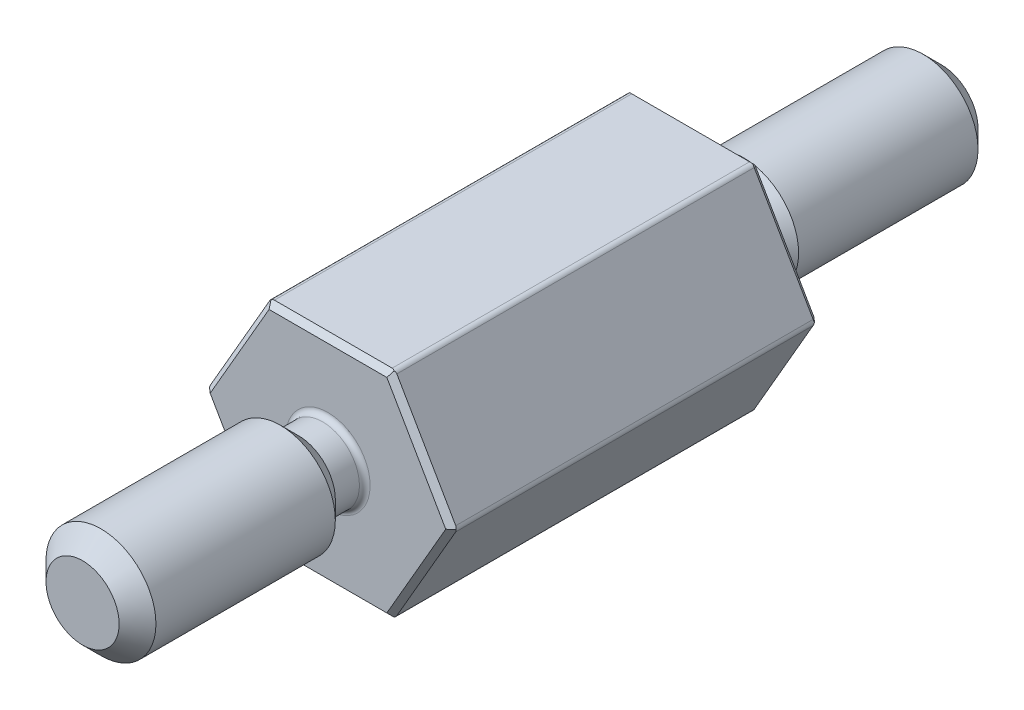
ISO-10303-21;
HEADER;
FILE_DESCRIPTION(('STEP AP214'),'2;1');
FILE_NAME('part.step','',(''),(''),'','','');
FILE_SCHEMA(('AUTOMOTIVE_DESIGN { 1 0 10303 214 1 1 1 1 }'));
ENDSEC;
DATA;
#1=APPLICATION_CONTEXT('core data for automotive mechanical design processes');
#2=APPLICATION_PROTOCOL_DEFINITION('international standard','automotive_design',2000,#1);
#3=PRODUCT_CONTEXT('',#1,'mechanical');
#4=PRODUCT('Part','Part','',(#3));
#5=PRODUCT_RELATED_PRODUCT_CATEGORY('part','',(#4));
#6=PRODUCT_DEFINITION_FORMATION('','',#4);
#7=PRODUCT_DEFINITION_CONTEXT('part definition',#1,'design');
#8=PRODUCT_DEFINITION('design','',#6,#7);
#9=PRODUCT_DEFINITION_SHAPE('','',#8);
#10=(LENGTH_UNIT() NAMED_UNIT(*) SI_UNIT(.MILLI.,.METRE.));
#11=(NAMED_UNIT(*) PLANE_ANGLE_UNIT() SI_UNIT($,.RADIAN.));
#12=(NAMED_UNIT(*) SI_UNIT($,.STERADIAN.) SOLID_ANGLE_UNIT());
#13=UNCERTAINTY_MEASURE_WITH_UNIT(LENGTH_MEASURE(1.E-05),#10,'distance_accuracy_value','');
#14=(GEOMETRIC_REPRESENTATION_CONTEXT(3) GLOBAL_UNCERTAINTY_ASSIGNED_CONTEXT((#13)) GLOBAL_UNIT_ASSIGNED_CONTEXT((#10,
#11,#12)) REPRESENTATION_CONTEXT('',''));
#15=CARTESIAN_POINT('',(0.,0.,0.));
#16=DIRECTION('',(0.,0.,1.));
#17=DIRECTION('',(1.,0.,0.));
#18=AXIS2_PLACEMENT_3D('',#15,#16,#17);
#19=CARTESIAN_POINT('',(0.,0.946150000000001,-11.1125));
#20=DIRECTION('',(0.,0.,1.));
#21=DIRECTION('',(1.,0.,0.));
#22=AXIS2_PLACEMENT_3D('',#19,#20,#21);
#23=PLANE('',#22);
#24=CARTESIAN_POINT('',(0.,0.,-11.1125));
#25=DIRECTION('',(0.,0.,1.));
#26=DIRECTION('',(1.,0.,0.));
#27=AXIS2_PLACEMENT_3D('',#24,#25,#26);
#28=CIRCLE('',#27,0.946150000000001);
#29=CARTESIAN_POINT('',(0.946150000000001,0.,-11.1125));
#30=VERTEX_POINT('',#29);
#31=EDGE_CURVE('E289',#30,#30,#28,.T.);
#32=ORIENTED_EDGE('',*,*,#31,.F.);
#33=EDGE_LOOP('',(#32));
#34=FACE_BOUND('',#33,.T.);
#35=ADVANCED_FACE('F37',(#34),#23,.F.);
#36=CARTESIAN_POINT('',(0.,2.778125,-4.7625));
#37=DIRECTION('',(0.,0.,1.));
#38=DIRECTION('',(1.,0.,0.));
#39=AXIS2_PLACEMENT_3D('',#36,#37,#38);
#40=PLANE('',#39);
#41=CARTESIAN_POINT('',(0.,0.,-4.7625));
#42=DIRECTION('',(0.,0.,1.));
#43=DIRECTION('',(1.,0.,0.));
#44=AXIS2_PLACEMENT_3D('',#41,#42,#43);
#45=CIRCLE('',#44,1.09140625);
#46=CARTESIAN_POINT('',(1.09140625,0.,-4.7625));
#47=VERTEX_POINT('',#46);
#48=EDGE_CURVE('E278',#47,#47,#45,.T.);
#49=ORIENTED_EDGE('',*,*,#48,.T.);
#50=EDGE_LOOP('',(#49));
#51=FACE_BOUND('',#50,.T.);
#52=DIRECTION('',(-0.5,0.866025403784439,0.));
#53=VECTOR('',#52,1.);
#54=CARTESIAN_POINT('',(-3.08760609194042,0.0694531250000091,-4.7625));
#55=LINE('',#54,#53);
#56=CARTESIAN_POINT('',(-1.5237536557628,-2.63921874999999,-4.7625));
#57=VERTEX_POINT('',#56);
#58=CARTESIAN_POINT('',(-3.0475073115256,0.,-4.7625));
#59=VERTEX_POINT('',#58);
#60=EDGE_CURVE('E228',#57,#59,#55,.T.);
#61=ORIENTED_EDGE('',*,*,#60,.T.);
#62=DIRECTION('',(0.5,0.866025403784439,0.));
#63=VECTOR('',#62,1.);
#64=CARTESIAN_POINT('',(-1.48365487534799,2.708671875,-4.7625));
#65=LINE('',#64,#63);
#66=CARTESIAN_POINT('',(-1.5237536557628,2.63921874999999,-4.7625));
#67=VERTEX_POINT('',#66);
#68=EDGE_CURVE('E205',#59,#67,#65,.T.);
#69=ORIENTED_EDGE('',*,*,#68,.T.);
#70=DIRECTION('',(1.,0.,0.));
#71=VECTOR('',#70,1.);
#72=CARTESIAN_POINT('',(1.60395121659242,2.63921874999999,-4.7625));
#73=LINE('',#72,#71);
#74=CARTESIAN_POINT('',(1.5237536557628,2.63921874999999,-4.7625));
#75=VERTEX_POINT('',#74);
#76=EDGE_CURVE('E216',#67,#75,#73,.T.);
#77=ORIENTED_EDGE('',*,*,#76,.T.);
#78=DIRECTION('',(0.5,-0.866025403784439,0.));
#79=VECTOR('',#78,1.);
#80=CARTESIAN_POINT('',(3.08760609194041,-0.0694531250000036,-4.7625));
#81=LINE('',#80,#79);
#82=CARTESIAN_POINT('',(3.0475073115256,0.,-4.7625));
#83=VERTEX_POINT('',#82);
#84=EDGE_CURVE('E223',#75,#83,#81,.T.);
#85=ORIENTED_EDGE('',*,*,#84,.T.);
#86=DIRECTION('',(-0.5,-0.866025403784439,0.));
#87=VECTOR('',#86,1.);
#88=CARTESIAN_POINT('',(1.48365487534799,-2.70867187499999,-4.7625));
#89=LINE('',#88,#87);
#90=CARTESIAN_POINT('',(1.5237536557628,-2.63921874999999,-4.7625));
#91=VERTEX_POINT('',#90);
#92=EDGE_CURVE('E413',#83,#91,#89,.T.);
#93=ORIENTED_EDGE('',*,*,#92,.T.);
#94=DIRECTION('',(-1.,0.,0.));
#95=VECTOR('',#94,1.);
#96=CARTESIAN_POINT('',(-1.60395121659243,-2.63921874999999,-4.7625));
#97=LINE('',#96,#95);
#98=EDGE_CURVE('E234',#91,#57,#97,.T.);
#99=ORIENTED_EDGE('',*,*,#98,.T.);
#100=EDGE_LOOP('',(#61,#69,#77,#85,#93,#99));
#101=FACE_BOUND('',#100,.T.);
#102=ADVANCED_FACE('F226',(#51,#101),#40,.F.);
#103=CARTESIAN_POINT('',(0.,0.,11.1125));
#104=DIRECTION('',(0.,0.,1.));
#105=DIRECTION('',(1.,0.,0.));
#106=AXIS2_PLACEMENT_3D('',#103,#104,#105);
#107=CYLINDRICAL_SURFACE('',#106,0.9525);
#108=CARTESIAN_POINT('',(0.,0.,-4.90140625));
#109=DIRECTION('',(0.,0.,1.));
#110=DIRECTION('',(1.,0.,0.));
#111=AXIS2_PLACEMENT_3D('',#108,#109,#110);
#112=CIRCLE('',#111,0.9525);
#113=CARTESIAN_POINT('',(0.9525,0.,-4.90140625));
#114=VERTEX_POINT('',#113);
#115=EDGE_CURVE('E306',#114,#114,#112,.F.);
#116=ORIENTED_EDGE('',*,*,#115,.T.);
#117=EDGE_LOOP('',(#116));
#118=FACE_BOUND('',#117,.T.);
#119=CARTESIAN_POINT('',(0.,0.,-5.5245));
#120=DIRECTION('',(0.,0.,1.));
#121=DIRECTION('',(1.,0.,0.));
#122=AXIS2_PLACEMENT_3D('',#119,#120,#121);
#123=CIRCLE('',#122,0.9525);
#124=CARTESIAN_POINT('',(0.9525,0.,-5.5245));
#125=VERTEX_POINT('',#124);
#126=EDGE_CURVE('E490',#125,#125,#123,.T.);
#127=ORIENTED_EDGE('',*,*,#126,.T.);
#128=EDGE_LOOP('',(#127));
#129=FACE_BOUND('',#128,.T.);
#130=ADVANCED_FACE('F510',(#118,#129),#107,.T.);
#131=CARTESIAN_POINT('',(0.,0.,-5.9944));
#132=DIRECTION('',(0.,0.,-1.));
#133=DIRECTION('',(-1.,0.,0.));
#134=AXIS2_PLACEMENT_3D('',#131,#132,#133);
#135=CONICAL_SURFACE('',#134,1.4224,0.785398163397449);
#136=ORIENTED_EDGE('',*,*,#126,.F.);
#137=EDGE_LOOP('',(#136));
#138=FACE_BOUND('',#137,.T.);
#139=CARTESIAN_POINT('',(0.,0.,-5.9944));
#140=DIRECTION('',(0.,0.,1.));
#141=DIRECTION('',(1.,0.,0.));
#142=AXIS2_PLACEMENT_3D('',#139,#140,#141);
#143=CIRCLE('',#142,1.4224);
#144=CARTESIAN_POINT('',(1.4224,0.,-5.9944));
#145=VERTEX_POINT('',#144);
#146=EDGE_CURVE('E493',#145,#145,#143,.T.);
#147=ORIENTED_EDGE('',*,*,#146,.T.);
#148=EDGE_LOOP('',(#147));
#149=FACE_BOUND('',#148,.T.);
#150=ADVANCED_FACE('F619',(#138,#149),#135,.T.);
#151=CARTESIAN_POINT('',(0.,0.,11.1125));
#152=DIRECTION('',(0.,0.,1.));
#153=DIRECTION('',(1.,0.,0.));
#154=AXIS2_PLACEMENT_3D('',#151,#152,#153);
#155=CYLINDRICAL_SURFACE('',#154,1.4224);
#156=ORIENTED_EDGE('',*,*,#146,.F.);
#157=EDGE_LOOP('',(#156));
#158=FACE_BOUND('',#157,.T.);
#159=CARTESIAN_POINT('',(0.,0.,-10.63625));
#160=DIRECTION('',(0.,0.,1.));
#161=DIRECTION('',(1.,0.,0.));
#162=AXIS2_PLACEMENT_3D('',#159,#160,#161);
#163=CIRCLE('',#162,1.4224);
#164=CARTESIAN_POINT('',(1.4224,0.,-10.63625));
#165=VERTEX_POINT('',#164);
#166=EDGE_CURVE('E496',#165,#165,#163,.T.);
#167=ORIENTED_EDGE('',*,*,#166,.T.);
#168=EDGE_LOOP('',(#167));
#169=FACE_BOUND('',#168,.T.);
#170=ADVANCED_FACE('F615',(#158,#169),#155,.T.);
#171=CARTESIAN_POINT('',(0.,0.,-11.1125));
#172=DIRECTION('',(0.,0.,1.));
#173=DIRECTION('',(1.,0.,0.));
#174=AXIS2_PLACEMENT_3D('',#171,#172,#173);
#175=CONICAL_SURFACE('',#174,0.946150000000001,0.785398163397447);
#176=ORIENTED_EDGE('',*,*,#166,.F.);
#177=EDGE_LOOP('',(#176));
#178=FACE_BOUND('',#177,.T.);
#179=ORIENTED_EDGE('',*,*,#31,.T.);
#180=EDGE_LOOP('',(#179));
#181=FACE_BOUND('',#180,.T.);
#182=ADVANCED_FACE('F502',(#178,#181),#175,.T.);
#183=CARTESIAN_POINT('',(-1.60395121659243,2.778125,-4.7625));
#184=DIRECTION('',(-0.866025403784439,0.5,0.));
#185=DIRECTION('',(-0.5,-0.866025403784439,0.));
#186=AXIS2_PLACEMENT_3D('',#183,#184,#185);
#187=PLANE('',#186);
#188=DIRECTION('',(-0.5,-0.866025403784439,0.));
#189=VECTOR('',#188,1.);
#190=CARTESIAN_POINT('',(-3.20790243318485,0.,-4.62359374999999));
#191=LINE('',#190,#189);
#192=CARTESIAN_POINT('',(-1.64404999700724,2.708671875,-4.62359374999999));
#193=VERTEX_POINT('',#192);
#194=CARTESIAN_POINT('',(-3.16780365277004,0.0694531250000045,-4.62359374999999));
#195=VERTEX_POINT('',#194);
#196=EDGE_CURVE('E224',#193,#195,#191,.T.);
#197=ORIENTED_EDGE('',*,*,#196,.T.);
#198=DIRECTION('',(0.,0.,1.));
#199=VECTOR('',#198,1.);
#200=CARTESIAN_POINT('',(-3.16780365277004,0.0694531250000048,-4.7625));
#201=LINE('',#200,#199);
#202=CARTESIAN_POINT('',(-3.16780365277004,0.0694531250000048,4.62359375));
#203=VERTEX_POINT('',#202);
#204=EDGE_CURVE('E317',#195,#203,#201,.T.);
#205=ORIENTED_EDGE('',*,*,#204,.T.);
#206=DIRECTION('',(0.5,0.866025403784439,0.));
#207=VECTOR('',#206,1.);
#208=CARTESIAN_POINT('',(-1.60395121659243,2.778125,4.62359375));
#209=LINE('',#208,#207);
#210=CARTESIAN_POINT('',(-1.64404999700724,2.708671875,4.62359375));
#211=VERTEX_POINT('',#210);
#212=EDGE_CURVE('E469',#203,#211,#209,.T.);
#213=ORIENTED_EDGE('',*,*,#212,.T.);
#214=DIRECTION('',(0.,0.,1.));
#215=VECTOR('',#214,1.);
#216=CARTESIAN_POINT('',(-1.64404999700724,2.708671875,-4.7625));
#217=LINE('',#216,#215);
#218=EDGE_CURVE('E315',#211,#193,#217,.F.);
#219=ORIENTED_EDGE('',*,*,#218,.T.);
#220=EDGE_LOOP('',(#197,#205,#213,#219));
#221=FACE_BOUND('',#220,.T.);
#222=ADVANCED_FACE('F468',(#221),#187,.T.);
#223=CARTESIAN_POINT('',(1.60395121659242,2.778125,-4.7625));
#224=DIRECTION('',(0.,1.,0.));
#225=DIRECTION('',(-1.,0.,0.));
#226=AXIS2_PLACEMENT_3D('',#223,#224,#225);
#227=PLANE('',#226);
#228=DIRECTION('',(-1.,0.,0.));
#229=VECTOR('',#228,1.);
#230=CARTESIAN_POINT('',(-1.60395121659243,2.778125,-4.62359374999999));
#231=LINE('',#230,#229);
#232=CARTESIAN_POINT('',(1.5237536557628,2.778125,-4.62359374999999));
#233=VERTEX_POINT('',#232);
#234=CARTESIAN_POINT('',(-1.52375365576281,2.778125,-4.62359374999999));
#235=VERTEX_POINT('',#234);
#236=EDGE_CURVE('E260',#233,#235,#231,.T.);
#237=ORIENTED_EDGE('',*,*,#236,.T.);
#238=DIRECTION('',(0.,0.,1.));
#239=VECTOR('',#238,1.);
#240=CARTESIAN_POINT('',(-1.52375365576281,2.778125,-4.7625));
#241=LINE('',#240,#239);
#242=CARTESIAN_POINT('',(-1.52375365576281,2.778125,4.62359375));
#243=VERTEX_POINT('',#242);
#244=EDGE_CURVE('E381',#235,#243,#241,.T.);
#245=ORIENTED_EDGE('',*,*,#244,.T.);
#246=DIRECTION('',(1.,0.,0.));
#247=VECTOR('',#246,1.);
#248=CARTESIAN_POINT('',(1.60395121659242,2.778125,4.62359375));
#249=LINE('',#248,#247);
#250=CARTESIAN_POINT('',(1.5237536557628,2.778125,4.62359375));
#251=VERTEX_POINT('',#250);
#252=EDGE_CURVE('E258',#243,#251,#249,.T.);
#253=ORIENTED_EDGE('',*,*,#252,.T.);
#254=DIRECTION('',(0.,0.,1.));
#255=VECTOR('',#254,1.);
#256=CARTESIAN_POINT('',(1.5237536557628,2.778125,-4.7625));
#257=LINE('',#256,#255);
#258=EDGE_CURVE('E379',#251,#233,#257,.F.);
#259=ORIENTED_EDGE('',*,*,#258,.T.);
#260=EDGE_LOOP('',(#237,#245,#253,#259));
#261=FACE_BOUND('',#260,.T.);
#262=ADVANCED_FACE('F564',(#261),#227,.T.);
#263=CARTESIAN_POINT('',(3.20790243318485,0.,-4.7625));
#264=DIRECTION('',(0.866025403784439,0.5,0.));
#265=DIRECTION('',(-0.5,0.866025403784439,0.));
#266=AXIS2_PLACEMENT_3D('',#263,#264,#265);
#267=PLANE('',#266);
#268=DIRECTION('',(0.5,-0.866025403784439,0.));
#269=VECTOR('',#268,1.);
#270=CARTESIAN_POINT('',(3.20790243318485,0.,4.62359375));
#271=LINE('',#270,#269);
#272=CARTESIAN_POINT('',(1.64404999700724,2.708671875,4.62359375));
#273=VERTEX_POINT('',#272);
#274=CARTESIAN_POINT('',(3.16780365277004,0.0694531250000003,4.62359375));
#275=VERTEX_POINT('',#274);
#276=EDGE_CURVE('E252',#273,#275,#271,.T.);
#277=ORIENTED_EDGE('',*,*,#276,.T.);
#278=DIRECTION('',(0.,0.,1.));
#279=VECTOR('',#278,1.);
#280=CARTESIAN_POINT('',(3.16780365277004,0.0694531250000004,-4.7625));
#281=LINE('',#280,#279);
#282=CARTESIAN_POINT('',(3.16780365277004,0.0694531250000005,-4.62359374999999));
#283=VERTEX_POINT('',#282);
#284=EDGE_CURVE('E373',#275,#283,#281,.F.);
#285=ORIENTED_EDGE('',*,*,#284,.T.);
#286=DIRECTION('',(-0.5,0.866025403784439,0.));
#287=VECTOR('',#286,1.);
#288=CARTESIAN_POINT('',(1.60395121659242,2.778125,-4.62359374999999));
#289=LINE('',#288,#287);
#290=CARTESIAN_POINT('',(1.64404999700724,2.708671875,-4.62359374999999));
#291=VERTEX_POINT('',#290);
#292=EDGE_CURVE('E255',#283,#291,#289,.T.);
#293=ORIENTED_EDGE('',*,*,#292,.T.);
#294=DIRECTION('',(0.,0.,1.));
#295=VECTOR('',#294,1.);
#296=CARTESIAN_POINT('',(1.64404999700724,2.708671875,-4.7625));
#297=LINE('',#296,#295);
#298=EDGE_CURVE('E370',#291,#273,#297,.T.);
#299=ORIENTED_EDGE('',*,*,#298,.T.);
#300=EDGE_LOOP('',(#277,#285,#293,#299));
#301=FACE_BOUND('',#300,.T.);
#302=ADVANCED_FACE('F395',(#301),#267,.T.);
#303=CARTESIAN_POINT('',(1.60395121659243,-2.77812499999999,-4.7625));
#304=DIRECTION('',(0.866025403784439,-0.5,0.));
#305=DIRECTION('',(0.5,0.866025403784439,0.));
#306=AXIS2_PLACEMENT_3D('',#303,#304,#305);
#307=PLANE('',#306);
#308=DIRECTION('',(-0.5,-0.866025403784439,0.));
#309=VECTOR('',#308,1.);
#310=CARTESIAN_POINT('',(1.60395121659243,-2.77812499999999,4.62359375));
#311=LINE('',#310,#309);
#312=CARTESIAN_POINT('',(3.16780365277004,-0.0694531250000001,4.62359375));
#313=VERTEX_POINT('',#312);
#314=CARTESIAN_POINT('',(1.64404999700724,-2.70867187499999,4.62359375));
#315=VERTEX_POINT('',#314);
#316=EDGE_CURVE('E246',#313,#315,#311,.T.);
#317=ORIENTED_EDGE('',*,*,#316,.T.);
#318=DIRECTION('',(0.,0.,1.));
#319=VECTOR('',#318,1.);
#320=CARTESIAN_POINT('',(1.64404999700724,-2.70867187499999,-4.7625));
#321=LINE('',#320,#319);
#322=CARTESIAN_POINT('',(1.64404999700724,-2.70867187499999,-4.62359374999999));
#323=VERTEX_POINT('',#322);
#324=EDGE_CURVE('E360',#315,#323,#321,.F.);
#325=ORIENTED_EDGE('',*,*,#324,.T.);
#326=DIRECTION('',(0.5,0.866025403784439,0.));
#327=VECTOR('',#326,1.);
#328=CARTESIAN_POINT('',(3.20790243318485,0.,-4.62359374999999));
#329=LINE('',#328,#327);
#330=CARTESIAN_POINT('',(3.16780365277004,-0.0694531249999996,-4.62359374999999));
#331=VERTEX_POINT('',#330);
#332=EDGE_CURVE('E249',#323,#331,#329,.T.);
#333=ORIENTED_EDGE('',*,*,#332,.T.);
#334=DIRECTION('',(0.,0.,1.));
#335=VECTOR('',#334,1.);
#336=CARTESIAN_POINT('',(3.16780365277004,-0.0694531250000001,-4.7625));
#337=LINE('',#336,#335);
#338=EDGE_CURVE('E357',#331,#313,#337,.T.);
#339=ORIENTED_EDGE('',*,*,#338,.T.);
#340=EDGE_LOOP('',(#317,#325,#333,#339));
#341=FACE_BOUND('',#340,.T.);
#342=ADVANCED_FACE('F416',(#341),#307,.T.);
#343=CARTESIAN_POINT('',(-1.60395121659243,-2.778125,-4.7625));
#344=DIRECTION('',(0.,-1.,0.));
#345=DIRECTION('',(1.,0.,0.));
#346=AXIS2_PLACEMENT_3D('',#343,#344,#345);
#347=PLANE('',#346);
#348=DIRECTION('',(-1.,0.,0.));
#349=VECTOR('',#348,1.);
#350=CARTESIAN_POINT('',(-1.60395121659243,-2.778125,4.62359375));
#351=LINE('',#350,#349);
#352=CARTESIAN_POINT('',(1.52375365576281,-2.77812499999999,4.62359375));
#353=VERTEX_POINT('',#352);
#354=CARTESIAN_POINT('',(-1.52375365576281,-2.778125,4.62359375));
#355=VERTEX_POINT('',#354);
#356=EDGE_CURVE('E240',#353,#355,#351,.T.);
#357=ORIENTED_EDGE('',*,*,#356,.T.);
#358=DIRECTION('',(0.,0.,1.));
#359=VECTOR('',#358,1.);
#360=CARTESIAN_POINT('',(-1.52375365576281,-2.778125,-4.7625));
#361=LINE('',#360,#359);
#362=CARTESIAN_POINT('',(-1.52375365576281,-2.778125,-4.62359374999999));
#363=VERTEX_POINT('',#362);
#364=EDGE_CURVE('E347',#355,#363,#361,.F.);
#365=ORIENTED_EDGE('',*,*,#364,.T.);
#366=DIRECTION('',(1.,0.,0.));
#367=VECTOR('',#366,1.);
#368=CARTESIAN_POINT('',(1.60395121659243,-2.77812499999999,-4.62359374999999));
#369=LINE('',#368,#367);
#370=CARTESIAN_POINT('',(1.52375365576281,-2.77812499999999,-4.62359374999999));
#371=VERTEX_POINT('',#370);
#372=EDGE_CURVE('E243',#363,#371,#369,.T.);
#373=ORIENTED_EDGE('',*,*,#372,.T.);
#374=DIRECTION('',(0.,0.,1.));
#375=VECTOR('',#374,1.);
#376=CARTESIAN_POINT('',(1.52375365576281,-2.77812499999999,-4.7625));
#377=LINE('',#376,#375);
#378=EDGE_CURVE('E344',#371,#353,#377,.T.);
#379=ORIENTED_EDGE('',*,*,#378,.T.);
#380=EDGE_LOOP('',(#357,#365,#373,#379));
#381=FACE_BOUND('',#380,.T.);
#382=ADVANCED_FACE('F435',(#381),#347,.T.);
#383=CARTESIAN_POINT('',(-3.20790243318485,0.,-4.7625));
#384=DIRECTION('',(-0.866025403784439,-0.5,0.));
#385=DIRECTION('',(0.5,-0.866025403784439,0.));
#386=AXIS2_PLACEMENT_3D('',#383,#384,#385);
#387=PLANE('',#386);
#388=DIRECTION('',(-0.5,0.866025403784439,0.));
#389=VECTOR('',#388,1.);
#390=CARTESIAN_POINT('',(-3.20790243318485,0.,4.62359375));
#391=LINE('',#390,#389);
#392=CARTESIAN_POINT('',(-1.64404999700724,-2.708671875,4.62359375));
#393=VERTEX_POINT('',#392);
#394=CARTESIAN_POINT('',(-3.16780365277004,-0.0694531249999952,4.62359375));
#395=VERTEX_POINT('',#394);
#396=EDGE_CURVE('E229',#393,#395,#391,.T.);
#397=ORIENTED_EDGE('',*,*,#396,.T.);
#398=DIRECTION('',(0.,0.,1.));
#399=VECTOR('',#398,1.);
#400=CARTESIAN_POINT('',(-3.16780365277004,-0.0694531249999951,-4.7625));
#401=LINE('',#400,#399);
#402=CARTESIAN_POINT('',(-3.16780365277004,-0.0694531249999949,-4.62359374999999));
#403=VERTEX_POINT('',#402);
#404=EDGE_CURVE('E331',#395,#403,#401,.F.);
#405=ORIENTED_EDGE('',*,*,#404,.T.);
#406=DIRECTION('',(0.5,-0.866025403784439,0.));
#407=VECTOR('',#406,1.);
#408=CARTESIAN_POINT('',(-1.60395121659243,-2.778125,-4.62359374999999));
#409=LINE('',#408,#407);
#410=CARTESIAN_POINT('',(-1.64404999700724,-2.70867187499999,-4.62359374999999));
#411=VERTEX_POINT('',#410);
#412=EDGE_CURVE('E232',#403,#411,#409,.T.);
#413=ORIENTED_EDGE('',*,*,#412,.T.);
#414=DIRECTION('',(0.,0.,1.));
#415=VECTOR('',#414,1.);
#416=CARTESIAN_POINT('',(-1.64404999700724,-2.70867187499999,-4.7625));
#417=LINE('',#416,#415);
#418=EDGE_CURVE('E328',#411,#393,#417,.T.);
#419=ORIENTED_EDGE('',*,*,#418,.T.);
#420=EDGE_LOOP('',(#397,#405,#413,#419));
#421=FACE_BOUND('',#420,.T.);
#422=ADVANCED_FACE('F452',(#421),#387,.T.);
#423=CARTESIAN_POINT('',(0.,0.,11.1125));
#424=DIRECTION('',(0.,0.,-1.));
#425=DIRECTION('',(-1.,0.,0.));
#426=AXIS2_PLACEMENT_3D('',#423,#424,#425);
#427=PLANE('',#426);
#428=CARTESIAN_POINT('',(0.,0.,11.1125));
#429=DIRECTION('',(0.,0.,1.));
#430=DIRECTION('',(1.,0.,0.));
#431=AXIS2_PLACEMENT_3D('',#428,#429,#430);
#432=CIRCLE('',#431,0.946149999999999);
#433=CARTESIAN_POINT('',(0.946149999999999,0.,11.1125));
#434=VERTEX_POINT('',#433);
#435=EDGE_CURVE('E473',#434,#434,#432,.T.);
#436=ORIENTED_EDGE('',*,*,#435,.T.);
#437=EDGE_LOOP('',(#436));
#438=FACE_BOUND('',#437,.T.);
#439=ADVANCED_FACE('F515',(#438),#427,.F.);
#440=CARTESIAN_POINT('',(0.,0.,10.63625));
#441=DIRECTION('',(0.,0.,-1.));
#442=DIRECTION('',(-1.,0.,0.));
#443=AXIS2_PLACEMENT_3D('',#440,#441,#442);
#444=CONICAL_SURFACE('',#443,1.4224,0.78539816339745);
#445=ORIENTED_EDGE('',*,*,#435,.F.);
#446=EDGE_LOOP('',(#445));
#447=FACE_BOUND('',#446,.T.);
#448=CARTESIAN_POINT('',(0.,0.,10.63625));
#449=DIRECTION('',(0.,0.,1.));
#450=DIRECTION('',(1.,0.,0.));
#451=AXIS2_PLACEMENT_3D('',#448,#449,#450);
#452=CIRCLE('',#451,1.4224);
#453=CARTESIAN_POINT('',(1.4224,0.,10.63625));
#454=VERTEX_POINT('',#453);
#455=EDGE_CURVE('E477',#454,#454,#452,.T.);
#456=ORIENTED_EDGE('',*,*,#455,.T.);
#457=EDGE_LOOP('',(#456));
#458=FACE_BOUND('',#457,.T.);
#459=ADVANCED_FACE('F586',(#447,#458),#444,.T.);
#460=CARTESIAN_POINT('',(0.,0.,11.1125));
#461=DIRECTION('',(0.,0.,1.));
#462=DIRECTION('',(1.,0.,0.));
#463=AXIS2_PLACEMENT_3D('',#460,#461,#462);
#464=CYLINDRICAL_SURFACE('',#463,1.4224);
#465=ORIENTED_EDGE('',*,*,#455,.F.);
#466=EDGE_LOOP('',(#465));
#467=FACE_BOUND('',#466,.T.);
#468=CARTESIAN_POINT('',(0.,0.,5.9944));
#469=DIRECTION('',(0.,0.,1.));
#470=DIRECTION('',(1.,0.,0.));
#471=AXIS2_PLACEMENT_3D('',#468,#469,#470);
#472=CIRCLE('',#471,1.4224);
#473=CARTESIAN_POINT('',(1.4224,0.,5.9944));
#474=VERTEX_POINT('',#473);
#475=EDGE_CURVE('E484',#474,#474,#472,.T.);
#476=ORIENTED_EDGE('',*,*,#475,.T.);
#477=EDGE_LOOP('',(#476));
#478=FACE_BOUND('',#477,.T.);
#479=ADVANCED_FACE('F583',(#467,#478),#464,.T.);
#480=CARTESIAN_POINT('',(0.,0.,5.5245));
#481=DIRECTION('',(0.,0.,1.));
#482=DIRECTION('',(1.,0.,0.));
#483=AXIS2_PLACEMENT_3D('',#480,#481,#482);
#484=CONICAL_SURFACE('',#483,0.9525,0.785398163397452);
#485=ORIENTED_EDGE('',*,*,#475,.F.);
#486=EDGE_LOOP('',(#485));
#487=FACE_BOUND('',#486,.T.);
#488=CARTESIAN_POINT('',(0.,0.,5.5245));
#489=DIRECTION('',(0.,0.,1.));
#490=DIRECTION('',(1.,0.,0.));
#491=AXIS2_PLACEMENT_3D('',#488,#489,#490);
#492=CIRCLE('',#491,0.9525);
#493=CARTESIAN_POINT('',(0.9525,0.,5.5245));
#494=VERTEX_POINT('',#493);
#495=EDGE_CURVE('E487',#494,#494,#492,.T.);
#496=ORIENTED_EDGE('',*,*,#495,.T.);
#497=EDGE_LOOP('',(#496));
#498=FACE_BOUND('',#497,.T.);
#499=ADVANCED_FACE('F576',(#487,#498),#484,.T.);
#500=CARTESIAN_POINT('',(0.,0.,11.1125));
#501=DIRECTION('',(0.,0.,1.));
#502=DIRECTION('',(1.,0.,0.));
#503=AXIS2_PLACEMENT_3D('',#500,#501,#502);
#504=CYLINDRICAL_SURFACE('',#503,0.9525);
#505=CARTESIAN_POINT('',(0.,0.,4.90140625));
#506=DIRECTION('',(0.,0.,-1.));
#507=DIRECTION('',(-1.,0.,0.));
#508=AXIS2_PLACEMENT_3D('',#505,#506,#507);
#509=CIRCLE('',#508,0.9525);
#510=CARTESIAN_POINT('',(-0.9525,0.,4.90140625));
#511=VERTEX_POINT('',#510);
#512=EDGE_CURVE('E309',#511,#511,#509,.F.);
#513=ORIENTED_EDGE('',*,*,#512,.T.);
#514=EDGE_LOOP('',(#513));
#515=FACE_BOUND('',#514,.T.);
#516=ORIENTED_EDGE('',*,*,#495,.F.);
#517=EDGE_LOOP('',(#516));
#518=FACE_BOUND('',#517,.T.);
#519=ADVANCED_FACE('F570',(#515,#518),#504,.T.);
#520=CARTESIAN_POINT('',(0.,0.9525,4.7625));
#521=DIRECTION('',(0.,0.,-1.));
#522=DIRECTION('',(-1.,0.,0.));
#523=AXIS2_PLACEMENT_3D('',#520,#521,#522);
#524=PLANE('',#523);
#525=CARTESIAN_POINT('',(0.,0.,4.7625));
#526=DIRECTION('',(0.,0.,-1.));
#527=DIRECTION('',(-1.,0.,0.));
#528=AXIS2_PLACEMENT_3D('',#525,#526,#527);
#529=CIRCLE('',#528,1.09140625);
#530=CARTESIAN_POINT('',(-1.09140625,0.,4.7625));
#531=VERTEX_POINT('',#530);
#532=EDGE_CURVE('E312',#531,#531,#529,.T.);
#533=ORIENTED_EDGE('',*,*,#532,.T.);
#534=EDGE_LOOP('',(#533));
#535=FACE_BOUND('',#534,.T.);
#536=DIRECTION('',(0.5,-0.866025403784439,0.));
#537=VECTOR('',#536,1.);
#538=CARTESIAN_POINT('',(-1.48365487534799,-2.70867187499999,4.7625));
#539=LINE('',#538,#537);
#540=CARTESIAN_POINT('',(-3.04750731152561,0.,4.7625));
#541=VERTEX_POINT('',#540);
#542=CARTESIAN_POINT('',(-1.5237536557628,-2.63921874999999,4.7625));
#543=VERTEX_POINT('',#542);
#544=EDGE_CURVE('E273',#541,#543,#539,.T.);
#545=ORIENTED_EDGE('',*,*,#544,.T.);
#546=DIRECTION('',(1.,0.,0.));
#547=VECTOR('',#546,1.);
#548=CARTESIAN_POINT('',(1.60395121659243,-2.63921874999999,4.7625));
#549=LINE('',#548,#547);
#550=CARTESIAN_POINT('',(1.5237536557628,-2.63921874999999,4.7625));
#551=VERTEX_POINT('',#550);
#552=EDGE_CURVE('E275',#543,#551,#549,.T.);
#553=ORIENTED_EDGE('',*,*,#552,.T.);
#554=DIRECTION('',(0.5,0.866025403784439,0.));
#555=VECTOR('',#554,1.);
#556=CARTESIAN_POINT('',(3.08760609194042,0.069453125000002,4.7625));
#557=LINE('',#556,#555);
#558=CARTESIAN_POINT('',(3.04750731152561,0.,4.7625));
#559=VERTEX_POINT('',#558);
#560=EDGE_CURVE('E263',#551,#559,#557,.T.);
#561=ORIENTED_EDGE('',*,*,#560,.T.);
#562=DIRECTION('',(-0.5,0.866025403784439,0.));
#563=VECTOR('',#562,1.);
#564=CARTESIAN_POINT('',(1.48365487534799,2.708671875,4.7625));
#565=LINE('',#564,#563);
#566=CARTESIAN_POINT('',(1.5237536557628,2.63921875,4.7625));
#567=VERTEX_POINT('',#566);
#568=EDGE_CURVE('E266',#559,#567,#565,.T.);
#569=ORIENTED_EDGE('',*,*,#568,.T.);
#570=DIRECTION('',(-1.,0.,0.));
#571=VECTOR('',#570,1.);
#572=CARTESIAN_POINT('',(-1.60395121659243,2.63921875,4.7625));
#573=LINE('',#572,#571);
#574=CARTESIAN_POINT('',(-1.52375365576281,2.63921875,4.7625));
#575=VERTEX_POINT('',#574);
#576=EDGE_CURVE('E269',#567,#575,#573,.T.);
#577=ORIENTED_EDGE('',*,*,#576,.T.);
#578=DIRECTION('',(-0.5,-0.866025403784439,0.));
#579=VECTOR('',#578,1.);
#580=CARTESIAN_POINT('',(-3.08760609194042,-0.0694531249999958,4.7625));
#581=LINE('',#580,#579);
#582=EDGE_CURVE('E271',#575,#541,#581,.T.);
#583=ORIENTED_EDGE('',*,*,#582,.T.);
#584=EDGE_LOOP('',(#545,#553,#561,#569,#577,#583));
#585=FACE_BOUND('',#584,.T.);
#586=ADVANCED_FACE('F530',(#535,#585),#524,.F.);
#587=CARTESIAN_POINT('',(1.60395121659243,-2.77812499999999,-4.62359374999999));
#588=DIRECTION('',(0.612372435695794,-0.353553390593273,-0.707106781186548));
#589=DIRECTION('',(-0.5,-0.866025403784439,0.));
#590=AXIS2_PLACEMENT_3D('',#587,#588,#589);
#591=PLANE('',#590);
#592=ORIENTED_EDGE('',*,*,#332,.F.);
#593=CARTESIAN_POINT('',(1.52375365576281,-2.63921875,-4.76249999999999));
#594=DIRECTION('',(0.612372435695794,-0.353553390593273,-0.707106781186548));
#595=DIRECTION('',(0.612372435695795,-0.353553390593274,0.707106781186547));
#596=AXIS2_PLACEMENT_3D('',#593,#594,#595);
#597=ELLIPSE('',#596,0.196443102648388,0.13890625);
#598=CARTESIAN_POINT('',(1.59320678076281,-2.75951509124443,-4.64220365875556));
#599=VERTEX_POINT('',#598);
#600=EDGE_CURVE('E364',#323,#599,#597,.T.);
#601=ORIENTED_EDGE('',*,*,#600,.T.);
#602=DIRECTION('',(-0.377964473009229,0.654653670707976,-0.654653670707977));
#603=VECTOR('',#602,1.);
#604=CARTESIAN_POINT('',(1.60395121659243,-2.77812499999999,-4.62359374999999));
#605=LINE('',#604,#603);
#606=EDGE_CURVE('E284',#91,#599,#605,.F.);
#607=ORIENTED_EDGE('',*,*,#606,.F.);
#608=ORIENTED_EDGE('',*,*,#92,.F.);
#609=DIRECTION('',(-0.755928946018455,0.,-0.654653670707977));
#610=VECTOR('',#609,1.);
#611=CARTESIAN_POINT('',(3.20790243318485,0.,-4.62359374999999));
#612=LINE('',#611,#610);
#613=CARTESIAN_POINT('',(3.18641356152561,0.,-4.64220365875556));
#614=VERTEX_POINT('',#613);
#615=EDGE_CURVE('E287',#614,#83,#612,.T.);
#616=ORIENTED_EDGE('',*,*,#615,.F.);
#617=CARTESIAN_POINT('',(3.04750731152561,0.,-4.76249999999999));
#618=DIRECTION('',(0.612372435695794,-0.353553390593273,-0.707106781186548));
#619=DIRECTION('',(0.612372435695795,-0.353553390593274,0.707106781186547));
#620=AXIS2_PLACEMENT_3D('',#617,#618,#619);
#621=ELLIPSE('',#620,0.196443102648388,0.13890625);
#622=EDGE_CURVE('E362',#614,#331,#621,.T.);
#623=ORIENTED_EDGE('',*,*,#622,.T.);
#624=EDGE_LOOP('',(#592,#601,#607,#608,#616,#623));
#625=FACE_BOUND('',#624,.T.);
#626=ADVANCED_FACE('F411',(#625),#591,.T.);
#627=CARTESIAN_POINT('',(3.20790243318485,0.,-4.62359374999999));
#628=DIRECTION('',(0.612372435695794,0.353553390593274,-0.707106781186547));
#629=DIRECTION('',(0.5,-0.866025403784439,0.));
#630=AXIS2_PLACEMENT_3D('',#627,#628,#629);
#631=PLANE('',#630);
#632=ORIENTED_EDGE('',*,*,#292,.F.);
#633=CARTESIAN_POINT('',(3.04750731152561,0.,-4.76249999999999));
#634=DIRECTION('',(0.612372435695794,0.353553390593274,-0.707106781186547));
#635=DIRECTION('',(0.612372435695795,0.353553390593274,0.707106781186548));
#636=AXIS2_PLACEMENT_3D('',#633,#634,#635);
#637=ELLIPSE('',#636,0.196443102648388,0.13890625);
#638=EDGE_CURVE('E377',#283,#614,#637,.T.);
#639=ORIENTED_EDGE('',*,*,#638,.T.);
#640=ORIENTED_EDGE('',*,*,#615,.T.);
#641=ORIENTED_EDGE('',*,*,#84,.F.);
#642=DIRECTION('',(-0.377964473009228,-0.654653670707976,-0.654653670707977));
#643=VECTOR('',#642,1.);
#644=CARTESIAN_POINT('',(1.60395121659242,2.778125,-4.62359374999999));
#645=LINE('',#644,#643);
#646=CARTESIAN_POINT('',(1.5932067807628,2.75951509124443,-4.64220365875556));
#647=VERTEX_POINT('',#646);
#648=EDGE_CURVE('E219',#647,#75,#645,.T.);
#649=ORIENTED_EDGE('',*,*,#648,.F.);
#650=CARTESIAN_POINT('',(1.5237536557628,2.63921875,-4.76249999999999));
#651=DIRECTION('',(0.612372435695794,0.353553390593274,-0.707106781186547));
#652=DIRECTION('',(0.612372435695795,0.353553390593274,0.707106781186548));
#653=AXIS2_PLACEMENT_3D('',#650,#651,#652);
#654=ELLIPSE('',#653,0.196443102648388,0.13890625);
#655=EDGE_CURVE('E375',#647,#291,#654,.T.);
#656=ORIENTED_EDGE('',*,*,#655,.T.);
#657=EDGE_LOOP('',(#632,#639,#640,#641,#649,#656));
#658=FACE_BOUND('',#657,.T.);
#659=ADVANCED_FACE('F391',(#658),#631,.T.);
#660=CARTESIAN_POINT('',(-1.60395121659243,-2.778125,-4.62359374999999));
#661=DIRECTION('',(0.,-0.707106781186548,-0.707106781186547));
#662=DIRECTION('',(-1.,0.,0.));
#663=AXIS2_PLACEMENT_3D('',#660,#661,#662);
#664=PLANE('',#663);
#665=ORIENTED_EDGE('',*,*,#372,.F.);
#666=CARTESIAN_POINT('',(-1.52375365576281,-2.63921875,-4.76249999999999));
#667=DIRECTION('',(0.,-0.707106781186548,-0.707106781186547));
#668=DIRECTION('',(0.,-0.707106781186547,0.707106781186548));
#669=AXIS2_PLACEMENT_3D('',#666,#667,#668);
#670=ELLIPSE('',#669,0.196443102648388,0.13890625);
#671=CARTESIAN_POINT('',(-1.59320678076281,-2.75951509124443,-4.64220365875556));
#672=VERTEX_POINT('',#671);
#673=EDGE_CURVE('E351',#363,#672,#670,.T.);
#674=ORIENTED_EDGE('',*,*,#673,.T.);
#675=DIRECTION('',(0.377964473009229,0.654653670707976,-0.654653670707977));
#676=VECTOR('',#675,1.);
#677=CARTESIAN_POINT('',(-1.60395121659243,-2.778125,-4.62359374999999));
#678=LINE('',#677,#676);
#679=EDGE_CURVE('E212',#57,#672,#678,.F.);
#680=ORIENTED_EDGE('',*,*,#679,.F.);
#681=ORIENTED_EDGE('',*,*,#98,.F.);
#682=ORIENTED_EDGE('',*,*,#606,.T.);
#683=CARTESIAN_POINT('',(1.52375365576281,-2.63921875,-4.76249999999999));
#684=DIRECTION('',(0.,-0.707106781186548,-0.707106781186547));
#685=DIRECTION('',(0.,-0.707106781186547,0.707106781186548));
#686=AXIS2_PLACEMENT_3D('',#683,#684,#685);
#687=ELLIPSE('',#686,0.196443102648388,0.13890625);
#688=EDGE_CURVE('E349',#599,#371,#687,.T.);
#689=ORIENTED_EDGE('',*,*,#688,.T.);
#690=EDGE_LOOP('',(#665,#674,#680,#681,#682,#689));
#691=FACE_BOUND('',#690,.T.);
#692=ADVANCED_FACE('F431',(#691),#664,.T.);
#693=CARTESIAN_POINT('',(1.60395121659242,2.778125,-4.62359374999999));
#694=DIRECTION('',(0.,0.707106781186548,-0.707106781186547));
#695=DIRECTION('',(1.,0.,0.));
#696=AXIS2_PLACEMENT_3D('',#693,#694,#695);
#697=PLANE('',#696);
#698=DIRECTION('',(-0.37796447300923,0.654653670707976,0.654653670707977));
#699=VECTOR('',#698,1.);
#700=CARTESIAN_POINT('',(-1.14567944042316,1.984375,-5.41734375));
#701=LINE('',#700,#699);
#702=CARTESIAN_POINT('',(-1.59320678076281,2.75951509124443,-4.64220365875556));
#703=VERTEX_POINT('',#702);
#704=EDGE_CURVE('E200',#703,#67,#701,.F.);
#705=ORIENTED_EDGE('',*,*,#704,.F.);
#706=CARTESIAN_POINT('',(-1.52375365576281,2.63921875,-4.76249999999999));
#707=DIRECTION('',(0.,0.707106781186548,-0.707106781186547));
#708=DIRECTION('',(0.,0.707106781186547,0.707106781186548));
#709=AXIS2_PLACEMENT_3D('',#706,#707,#708);
#710=ELLIPSE('',#709,0.196443102648388,0.13890625);
#711=EDGE_CURVE('E11',#703,#235,#710,.T.);
#712=ORIENTED_EDGE('',*,*,#711,.T.);
#713=ORIENTED_EDGE('',*,*,#236,.F.);
#714=CARTESIAN_POINT('',(1.5237536557628,2.63921875,-4.76249999999999));
#715=DIRECTION('',(0.,0.707106781186548,-0.707106781186547));
#716=DIRECTION('',(0.,0.707106781186547,0.707106781186548));
#717=AXIS2_PLACEMENT_3D('',#714,#715,#716);
#718=ELLIPSE('',#717,0.196443102648388,0.13890625);
#719=EDGE_CURVE('E45',#233,#647,#718,.T.);
#720=ORIENTED_EDGE('',*,*,#719,.T.);
#721=ORIENTED_EDGE('',*,*,#648,.T.);
#722=ORIENTED_EDGE('',*,*,#76,.F.);
#723=EDGE_LOOP('',(#705,#712,#713,#720,#721,#722));
#724=FACE_BOUND('',#723,.T.);
#725=ADVANCED_FACE('F217',(#724),#697,.T.);
#726=CARTESIAN_POINT('',(-3.20790243318485,0.,-4.62359374999999));
#727=DIRECTION('',(-0.612372435695794,-0.353553390593273,-0.707106781186548));
#728=DIRECTION('',(-0.5,0.866025403784439,0.));
#729=AXIS2_PLACEMENT_3D('',#726,#727,#728);
#730=PLANE('',#729);
#731=ORIENTED_EDGE('',*,*,#412,.F.);
#732=CARTESIAN_POINT('',(-3.04750731152561,0.,-4.76249999999999));
#733=DIRECTION('',(-0.612372435695794,-0.353553390593273,-0.707106781186548));
#734=DIRECTION('',(-0.612372435695795,-0.353553390593273,0.707106781186547));
#735=AXIS2_PLACEMENT_3D('',#732,#733,#734);
#736=ELLIPSE('',#735,0.196443102648388,0.13890625);
#737=CARTESIAN_POINT('',(-3.18641356152561,0.,-4.64220365875556));
#738=VERTEX_POINT('',#737);
#739=EDGE_CURVE('E335',#403,#738,#736,.T.);
#740=ORIENTED_EDGE('',*,*,#739,.T.);
#741=DIRECTION('',(0.755928946018455,0.,-0.654653670707977));
#742=VECTOR('',#741,1.);
#743=CARTESIAN_POINT('',(-3.20790243318485,0.,-4.62359374999999));
#744=LINE('',#743,#742);
#745=EDGE_CURVE('E213',#59,#738,#744,.F.);
#746=ORIENTED_EDGE('',*,*,#745,.F.);
#747=ORIENTED_EDGE('',*,*,#60,.F.);
#748=ORIENTED_EDGE('',*,*,#679,.T.);
#749=CARTESIAN_POINT('',(-1.52375365576281,-2.63921875,-4.76249999999999));
#750=DIRECTION('',(-0.612372435695794,-0.353553390593273,-0.707106781186548));
#751=DIRECTION('',(-0.612372435695795,-0.353553390593273,0.707106781186547));
#752=AXIS2_PLACEMENT_3D('',#749,#750,#751);
#753=ELLIPSE('',#752,0.196443102648388,0.13890625);
#754=EDGE_CURVE('E333',#672,#411,#753,.T.);
#755=ORIENTED_EDGE('',*,*,#754,.T.);
#756=EDGE_LOOP('',(#731,#740,#746,#747,#748,#755));
#757=FACE_BOUND('',#756,.T.);
#758=ADVANCED_FACE('F449',(#757),#730,.T.);
#759=CARTESIAN_POINT('',(-1.60395121659243,2.778125,-4.62359374999999));
#760=DIRECTION('',(-0.612372435695794,0.353553390593273,-0.707106781186548));
#761=DIRECTION('',(0.5,0.866025403784439,0.));
#762=AXIS2_PLACEMENT_3D('',#759,#760,#761);
#763=PLANE('',#762);
#764=ORIENTED_EDGE('',*,*,#745,.T.);
#765=CARTESIAN_POINT('',(-3.04750731152561,0.,-4.76249999999999));
#766=DIRECTION('',(-0.612372435695794,0.353553390593273,-0.707106781186548));
#767=DIRECTION('',(-0.612372435695795,0.353553390593274,0.707106781186547));
#768=AXIS2_PLACEMENT_3D('',#765,#766,#767);
#769=ELLIPSE('',#768,0.196443102648387,0.13890625);
#770=EDGE_CURVE('E338',#738,#195,#769,.T.);
#771=ORIENTED_EDGE('',*,*,#770,.T.);
#772=ORIENTED_EDGE('',*,*,#196,.F.);
#773=CARTESIAN_POINT('',(-1.52375365576281,2.63921875,-4.76249999999999));
#774=DIRECTION('',(-0.612372435695794,0.353553390593273,-0.707106781186548));
#775=DIRECTION('',(-0.612372435695795,0.353553390593274,0.707106781186547));
#776=AXIS2_PLACEMENT_3D('',#773,#774,#775);
#777=ELLIPSE('',#776,0.196443102648387,0.13890625);
#778=EDGE_CURVE('E209',#193,#703,#777,.T.);
#779=ORIENTED_EDGE('',*,*,#778,.T.);
#780=ORIENTED_EDGE('',*,*,#704,.T.);
#781=ORIENTED_EDGE('',*,*,#68,.F.);
#782=EDGE_LOOP('',(#764,#771,#772,#779,#780,#781));
#783=FACE_BOUND('',#782,.T.);
#784=ADVANCED_FACE('F203',(#783),#763,.T.);
#785=CARTESIAN_POINT('',(0.,2.63921875,4.7625));
#786=DIRECTION('',(0.,0.707106781186546,0.707106781186549));
#787=DIRECTION('',(1.,0.,0.));
#788=AXIS2_PLACEMENT_3D('',#785,#786,#787);
#789=PLANE('',#788);
#790=ORIENTED_EDGE('',*,*,#252,.F.);
#791=CARTESIAN_POINT('',(-1.52375365576281,2.63921875,4.7625));
#792=DIRECTION('',(0.,0.707106781186546,0.707106781186549));
#793=DIRECTION('',(0.,-0.707106781186549,0.707106781186546));
#794=AXIS2_PLACEMENT_3D('',#791,#792,#793);
#795=ELLIPSE('',#794,0.196443102648387,0.13890625);
#796=CARTESIAN_POINT('',(-1.59320678076281,2.75951509124443,4.64220365875557));
#797=VERTEX_POINT('',#796);
#798=EDGE_CURVE('E60',#243,#797,#795,.T.);
#799=ORIENTED_EDGE('',*,*,#798,.T.);
#800=DIRECTION('',(0.37796447300923,-0.654653670707978,0.654653670707975));
#801=VECTOR('',#800,1.);
#802=CARTESIAN_POINT('',(-1.3060745620824,2.2621875,5.13953125));
#803=LINE('',#802,#801);
#804=EDGE_CURVE('E279',#575,#797,#803,.F.);
#805=ORIENTED_EDGE('',*,*,#804,.F.);
#806=ORIENTED_EDGE('',*,*,#576,.F.);
#807=DIRECTION('',(-0.377964473009233,-0.654653670707977,0.654653670707974));
#808=VECTOR('',#807,1.);
#809=CARTESIAN_POINT('',(1.4239158759545,2.46629464285714,4.93542410714286));
#810=LINE('',#809,#808);
#811=CARTESIAN_POINT('',(1.5932067807628,2.75951509124443,4.64220365875557));
#812=VERTEX_POINT('',#811);
#813=EDGE_CURVE('E300',#812,#567,#810,.T.);
#814=ORIENTED_EDGE('',*,*,#813,.F.);
#815=CARTESIAN_POINT('',(1.5237536557628,2.63921875,4.7625));
#816=DIRECTION('',(0.,0.707106781186546,0.707106781186549));
#817=DIRECTION('',(0.,-0.707106781186549,0.707106781186546));
#818=AXIS2_PLACEMENT_3D('',#815,#816,#817);
#819=ELLIPSE('',#818,0.196443102648387,0.13890625);
#820=EDGE_CURVE('E52',#812,#251,#819,.T.);
#821=ORIENTED_EDGE('',*,*,#820,.T.);
#822=EDGE_LOOP('',(#790,#799,#805,#806,#814,#821));
#823=FACE_BOUND('',#822,.T.);
#824=ADVANCED_FACE('F519',(#823),#789,.T.);
#825=CARTESIAN_POINT('',(-1.87318588509187,2.033984375,4.7625));
#826=DIRECTION('',(-0.612372435695792,0.353553390593272,0.70710678118655));
#827=DIRECTION('',(0.5,0.866025403784439,0.));
#828=AXIS2_PLACEMENT_3D('',#825,#826,#827);
#829=PLANE('',#828);
#830=ORIENTED_EDGE('',*,*,#212,.F.);
#831=CARTESIAN_POINT('',(-3.04750731152561,0.,4.7625));
#832=DIRECTION('',(-0.612372435695792,0.353553390593272,0.70710678118655));
#833=DIRECTION('',(0.612372435695797,-0.353553390593275,0.707106781186545));
#834=AXIS2_PLACEMENT_3D('',#831,#832,#833);
#835=ELLIPSE('',#834,0.196443102648387,0.13890625);
#836=CARTESIAN_POINT('',(-3.18641356152561,0.,4.64220365875557));
#837=VERTEX_POINT('',#836);
#838=EDGE_CURVE('E322',#203,#837,#835,.T.);
#839=ORIENTED_EDGE('',*,*,#838,.T.);
#840=DIRECTION('',(0.755928946018457,0.,0.654653670707974));
#841=VECTOR('',#840,1.);
#842=CARTESIAN_POINT('',(-2.37646649642061,0.,5.34363839285714));
#843=LINE('',#842,#841);
#844=EDGE_CURVE('E297',#541,#837,#843,.F.);
#845=ORIENTED_EDGE('',*,*,#844,.F.);
#846=ORIENTED_EDGE('',*,*,#582,.F.);
#847=ORIENTED_EDGE('',*,*,#804,.T.);
#848=CARTESIAN_POINT('',(-1.52375365576281,2.63921875,4.7625));
#849=DIRECTION('',(-0.612372435695792,0.353553390593272,0.70710678118655));
#850=DIRECTION('',(0.612372435695797,-0.353553390593275,0.707106781186545));
#851=AXIS2_PLACEMENT_3D('',#848,#849,#850);
#852=ELLIPSE('',#851,0.196443102648387,0.13890625);
#853=EDGE_CURVE('E320',#797,#211,#852,.T.);
#854=ORIENTED_EDGE('',*,*,#853,.T.);
#855=EDGE_LOOP('',(#830,#839,#845,#846,#847,#854));
#856=FACE_BOUND('',#855,.T.);
#857=ADVANCED_FACE('F472',(#856),#829,.T.);
#858=CARTESIAN_POINT('',(1.87318588509187,2.033984375,4.7625));
#859=DIRECTION('',(0.612372435695791,0.353553390593271,0.707106781186552));
#860=DIRECTION('',(0.5,-0.866025403784439,0.));
#861=AXIS2_PLACEMENT_3D('',#858,#859,#860);
#862=PLANE('',#861);
#863=DIRECTION('',(-0.755928946018459,0.,0.654653670707972));
#864=VECTOR('',#863,1.);
#865=CARTESIAN_POINT('',(2.847831751909,0.,4.93542410714286));
#866=LINE('',#865,#864);
#867=CARTESIAN_POINT('',(3.18641356152561,0.,4.64220365875557));
#868=VERTEX_POINT('',#867);
#869=EDGE_CURVE('E295',#868,#559,#866,.T.);
#870=ORIENTED_EDGE('',*,*,#869,.F.);
#871=CARTESIAN_POINT('',(3.04750731152561,0.,4.7625));
#872=DIRECTION('',(0.612372435695791,0.353553390593271,0.707106781186552));
#873=DIRECTION('',(-0.612372435695798,-0.353553390593276,0.707106781186543));
#874=AXIS2_PLACEMENT_3D('',#871,#872,#873);
#875=ELLIPSE('',#874,0.196443102648387,0.13890625);
#876=EDGE_CURVE('E368',#868,#275,#875,.T.);
#877=ORIENTED_EDGE('',*,*,#876,.T.);
#878=ORIENTED_EDGE('',*,*,#276,.F.);
#879=CARTESIAN_POINT('',(1.5237536557628,2.63921875,4.7625));
#880=DIRECTION('',(0.612372435695791,0.353553390593271,0.707106781186552));
#881=DIRECTION('',(-0.612372435695798,-0.353553390593276,0.707106781186543));
#882=AXIS2_PLACEMENT_3D('',#879,#880,#881);
#883=ELLIPSE('',#882,0.196443102648387,0.13890625);
#884=EDGE_CURVE('E366',#273,#812,#883,.T.);
#885=ORIENTED_EDGE('',*,*,#884,.T.);
#886=ORIENTED_EDGE('',*,*,#813,.T.);
#887=ORIENTED_EDGE('',*,*,#568,.F.);
#888=EDGE_LOOP('',(#870,#877,#878,#885,#886,#887));
#889=FACE_BOUND('',#888,.T.);
#890=ADVANCED_FACE('F399',(#889),#862,.T.);
#891=CARTESIAN_POINT('',(-2.69807508219654,-0.605234374999995,4.7625));
#892=DIRECTION('',(-0.612372435695792,-0.353553390593272,0.707106781186551));
#893=DIRECTION('',(-0.5,0.866025403784439,0.));
#894=AXIS2_PLACEMENT_3D('',#891,#892,#893);
#895=PLANE('',#894);
#896=ORIENTED_EDGE('',*,*,#844,.T.);
#897=CARTESIAN_POINT('',(-3.04750731152561,0.,4.7625));
#898=DIRECTION('',(-0.612372435695792,-0.353553390593272,0.707106781186551));
#899=DIRECTION('',(0.612372435695798,0.353553390593275,0.707106781186544));
#900=AXIS2_PLACEMENT_3D('',#897,#898,#899);
#901=ELLIPSE('',#900,0.196443102648387,0.13890625);
#902=EDGE_CURVE('E326',#837,#395,#901,.T.);
#903=ORIENTED_EDGE('',*,*,#902,.T.);
#904=ORIENTED_EDGE('',*,*,#396,.F.);
#905=CARTESIAN_POINT('',(-1.52375365576281,-2.63921875,4.7625));
#906=DIRECTION('',(-0.612372435695792,-0.353553390593272,0.707106781186551));
#907=DIRECTION('',(0.612372435695798,0.353553390593275,0.707106781186544));
#908=AXIS2_PLACEMENT_3D('',#905,#906,#907);
#909=ELLIPSE('',#908,0.196443102648387,0.13890625);
#910=CARTESIAN_POINT('',(-1.5932067807628,-2.75951509124443,4.64220365875557));
#911=VERTEX_POINT('',#910);
#912=EDGE_CURVE('E324',#393,#911,#909,.T.);
#913=ORIENTED_EDGE('',*,*,#912,.T.);
#914=DIRECTION('',(0.37796447300923,0.654653670707979,0.654653670707974));
#915=VECTOR('',#914,1.);
#916=CARTESIAN_POINT('',(-1.1882332482103,-2.05808035714285,5.34363839285714));
#917=LINE('',#916,#915);
#918=EDGE_CURVE('E292',#543,#911,#917,.F.);
#919=ORIENTED_EDGE('',*,*,#918,.F.);
#920=ORIENTED_EDGE('',*,*,#544,.F.);
#921=EDGE_LOOP('',(#896,#903,#904,#913,#919,#920));
#922=FACE_BOUND('',#921,.T.);
#923=ADVANCED_FACE('F455',(#922),#895,.T.);
#924=CARTESIAN_POINT('',(2.69807508219654,-0.605234374999996,4.7625));
#925=DIRECTION('',(0.612372435695791,-0.353553390593271,0.707106781186552));
#926=DIRECTION('',(-0.5,-0.866025403784439,0.));
#927=AXIS2_PLACEMENT_3D('',#924,#925,#926);
#928=PLANE('',#927);
#929=DIRECTION('',(0.377964473009232,-0.654653670707978,-0.654653670707973));
#930=VECTOR('',#929,1.);
#931=CARTESIAN_POINT('',(1.1882332482103,-2.05808035714285,5.34363839285714));
#932=LINE('',#931,#930);
#933=CARTESIAN_POINT('',(1.59320678076281,-2.75951509124443,4.64220365875557));
#934=VERTEX_POINT('',#933);
#935=EDGE_CURVE('E290',#934,#551,#932,.F.);
#936=ORIENTED_EDGE('',*,*,#935,.F.);
#937=CARTESIAN_POINT('',(1.52375365576281,-2.63921875,4.7625));
#938=DIRECTION('',(0.612372435695791,-0.353553390593271,0.707106781186552));
#939=DIRECTION('',(-0.612372435695799,0.353553390593276,0.707106781186543));
#940=AXIS2_PLACEMENT_3D('',#937,#938,#939);
#941=ELLIPSE('',#940,0.196443102648386,0.13890625);
#942=EDGE_CURVE('E355',#934,#315,#941,.T.);
#943=ORIENTED_EDGE('',*,*,#942,.T.);
#944=ORIENTED_EDGE('',*,*,#316,.F.);
#945=CARTESIAN_POINT('',(3.04750731152561,0.,4.7625));
#946=DIRECTION('',(0.612372435695791,-0.353553390593271,0.707106781186552));
#947=DIRECTION('',(-0.612372435695799,0.353553390593276,0.707106781186543));
#948=AXIS2_PLACEMENT_3D('',#945,#946,#947);
#949=ELLIPSE('',#948,0.196443102648386,0.13890625);
#950=EDGE_CURVE('E353',#313,#868,#949,.T.);
#951=ORIENTED_EDGE('',*,*,#950,.T.);
#952=ORIENTED_EDGE('',*,*,#869,.T.);
#953=ORIENTED_EDGE('',*,*,#560,.F.);
#954=EDGE_LOOP('',(#936,#943,#944,#951,#952,#953));
#955=FACE_BOUND('',#954,.T.);
#956=ADVANCED_FACE('F420',(#955),#928,.T.);
#957=CARTESIAN_POINT('',(0.,-2.63921874999999,4.7625));
#958=DIRECTION('',(0.,-0.707106781186545,0.70710678118655));
#959=DIRECTION('',(-1.,0.,0.));
#960=AXIS2_PLACEMENT_3D('',#957,#958,#959);
#961=PLANE('',#960);
#962=ORIENTED_EDGE('',*,*,#918,.T.);
#963=CARTESIAN_POINT('',(-1.52375365576281,-2.63921875,4.7625));
#964=DIRECTION('',(0.,-0.707106781186545,0.70710678118655));
#965=DIRECTION('',(0.,0.70710678118655,0.707106781186545));
#966=AXIS2_PLACEMENT_3D('',#963,#964,#965);
#967=ELLIPSE('',#966,0.196443102648387,0.13890625);
#968=EDGE_CURVE('E342',#911,#355,#967,.T.);
#969=ORIENTED_EDGE('',*,*,#968,.T.);
#970=ORIENTED_EDGE('',*,*,#356,.F.);
#971=CARTESIAN_POINT('',(1.52375365576281,-2.63921875,4.7625));
#972=DIRECTION('',(0.,-0.707106781186545,0.70710678118655));
#973=DIRECTION('',(0.,0.70710678118655,0.707106781186545));
#974=AXIS2_PLACEMENT_3D('',#971,#972,#973);
#975=ELLIPSE('',#974,0.196443102648387,0.13890625);
#976=EDGE_CURVE('E340',#353,#934,#975,.T.);
#977=ORIENTED_EDGE('',*,*,#976,.T.);
#978=ORIENTED_EDGE('',*,*,#935,.T.);
#979=ORIENTED_EDGE('',*,*,#552,.F.);
#980=EDGE_LOOP('',(#962,#969,#970,#977,#978,#979));
#981=FACE_BOUND('',#980,.T.);
#982=ADVANCED_FACE('F438',(#981),#961,.T.);
#983=CARTESIAN_POINT('',(0.,0.,-4.90140625));
#984=DIRECTION('',(0.,0.,1.));
#985=DIRECTION('',(1.,0.,0.));
#986=AXIS2_PLACEMENT_3D('',#983,#984,#985);
#987=TOROIDAL_SURFACE('',#986,1.09140625,0.13890625);
#988=ORIENTED_EDGE('',*,*,#115,.F.);
#989=EDGE_LOOP('',(#988));
#990=FACE_BOUND('',#989,.T.);
#991=ORIENTED_EDGE('',*,*,#48,.F.);
#992=EDGE_LOOP('',(#991));
#993=FACE_BOUND('',#992,.T.);
#994=ADVANCED_FACE('F533',(#990,#993),#987,.F.);
#995=CARTESIAN_POINT('',(0.,0.,4.90140625));
#996=DIRECTION('',(0.,0.,-1.));
#997=DIRECTION('',(-1.,0.,0.));
#998=AXIS2_PLACEMENT_3D('',#995,#996,#997);
#999=TOROIDAL_SURFACE('',#998,1.09140625,0.13890625);
#1000=ORIENTED_EDGE('',*,*,#532,.F.);
#1001=EDGE_LOOP('',(#1000));
#1002=FACE_BOUND('',#1001,.T.);
#1003=ORIENTED_EDGE('',*,*,#512,.F.);
#1004=EDGE_LOOP('',(#1003));
#1005=FACE_BOUND('',#1004,.T.);
#1006=ADVANCED_FACE('F546',(#1002,#1005),#999,.F.);
#1007=CARTESIAN_POINT('',(-3.04750731152561,0.,-4.7625));
#1008=DIRECTION('',(0.,0.,1.));
#1009=DIRECTION('',(1.,0.,0.));
#1010=AXIS2_PLACEMENT_3D('',#1007,#1008,#1009);
#1011=CYLINDRICAL_SURFACE('',#1010,0.13890625);
#1012=ORIENTED_EDGE('',*,*,#739,.F.);
#1013=ORIENTED_EDGE('',*,*,#404,.F.);
#1014=ORIENTED_EDGE('',*,*,#902,.F.);
#1015=ORIENTED_EDGE('',*,*,#838,.F.);
#1016=ORIENTED_EDGE('',*,*,#204,.F.);
#1017=ORIENTED_EDGE('',*,*,#770,.F.);
#1018=EDGE_LOOP('',(#1012,#1013,#1014,#1015,#1016,#1017));
#1019=FACE_BOUND('',#1018,.T.);
#1020=ADVANCED_FACE('F461',(#1019),#1011,.T.);
#1021=CARTESIAN_POINT('',(-1.52375365576281,-2.63921875,-4.7625));
#1022=DIRECTION('',(0.,0.,1.));
#1023=DIRECTION('',(1.,0.,0.));
#1024=AXIS2_PLACEMENT_3D('',#1021,#1022,#1023);
#1025=CYLINDRICAL_SURFACE('',#1024,0.13890625);
#1026=ORIENTED_EDGE('',*,*,#673,.F.);
#1027=ORIENTED_EDGE('',*,*,#364,.F.);
#1028=ORIENTED_EDGE('',*,*,#968,.F.);
#1029=ORIENTED_EDGE('',*,*,#912,.F.);
#1030=ORIENTED_EDGE('',*,*,#418,.F.);
#1031=ORIENTED_EDGE('',*,*,#754,.F.);
#1032=EDGE_LOOP('',(#1026,#1027,#1028,#1029,#1030,#1031));
#1033=FACE_BOUND('',#1032,.T.);
#1034=ADVANCED_FACE('F444',(#1033),#1025,.T.);
#1035=CARTESIAN_POINT('',(1.52375365576281,-2.63921875,-4.7625));
#1036=DIRECTION('',(0.,0.,1.));
#1037=DIRECTION('',(1.,0.,0.));
#1038=AXIS2_PLACEMENT_3D('',#1035,#1036,#1037);
#1039=CYLINDRICAL_SURFACE('',#1038,0.13890625);
#1040=ORIENTED_EDGE('',*,*,#600,.F.);
#1041=ORIENTED_EDGE('',*,*,#324,.F.);
#1042=ORIENTED_EDGE('',*,*,#942,.F.);
#1043=ORIENTED_EDGE('',*,*,#976,.F.);
#1044=ORIENTED_EDGE('',*,*,#378,.F.);
#1045=ORIENTED_EDGE('',*,*,#688,.F.);
#1046=EDGE_LOOP('',(#1040,#1041,#1042,#1043,#1044,#1045));
#1047=FACE_BOUND('',#1046,.T.);
#1048=ADVANCED_FACE('F425',(#1047),#1039,.T.);
#1049=CARTESIAN_POINT('',(3.04750731152561,0.,-4.7625));
#1050=DIRECTION('',(0.,0.,1.));
#1051=DIRECTION('',(1.,0.,0.));
#1052=AXIS2_PLACEMENT_3D('',#1049,#1050,#1051);
#1053=CYLINDRICAL_SURFACE('',#1052,0.13890625);
#1054=ORIENTED_EDGE('',*,*,#638,.F.);
#1055=ORIENTED_EDGE('',*,*,#284,.F.);
#1056=ORIENTED_EDGE('',*,*,#876,.F.);
#1057=ORIENTED_EDGE('',*,*,#950,.F.);
#1058=ORIENTED_EDGE('',*,*,#338,.F.);
#1059=ORIENTED_EDGE('',*,*,#622,.F.);
#1060=EDGE_LOOP('',(#1054,#1055,#1056,#1057,#1058,#1059));
#1061=FACE_BOUND('',#1060,.T.);
#1062=ADVANCED_FACE('F404',(#1061),#1053,.T.);
#1063=CARTESIAN_POINT('',(-1.52375365576281,2.63921875,-4.7625));
#1064=DIRECTION('',(0.,0.,1.));
#1065=DIRECTION('',(1.,0.,0.));
#1066=AXIS2_PLACEMENT_3D('',#1063,#1064,#1065);
#1067=CYLINDRICAL_SURFACE('',#1066,0.13890625);
#1068=ORIENTED_EDGE('',*,*,#778,.F.);
#1069=ORIENTED_EDGE('',*,*,#218,.F.);
#1070=ORIENTED_EDGE('',*,*,#853,.F.);
#1071=ORIENTED_EDGE('',*,*,#798,.F.);
#1072=ORIENTED_EDGE('',*,*,#244,.F.);
#1073=ORIENTED_EDGE('',*,*,#711,.F.);
#1074=EDGE_LOOP('',(#1068,#1069,#1070,#1071,#1072,#1073));
#1075=FACE_BOUND('',#1074,.T.);
#1076=ADVANCED_FACE('F558',(#1075),#1067,.T.);
#1077=CARTESIAN_POINT('',(1.5237536557628,2.63921875,-4.7625));
#1078=DIRECTION('',(0.,0.,1.));
#1079=DIRECTION('',(1.,0.,0.));
#1080=AXIS2_PLACEMENT_3D('',#1077,#1078,#1079);
#1081=CYLINDRICAL_SURFACE('',#1080,0.13890625);
#1082=ORIENTED_EDGE('',*,*,#719,.F.);
#1083=ORIENTED_EDGE('',*,*,#258,.F.);
#1084=ORIENTED_EDGE('',*,*,#820,.F.);
#1085=ORIENTED_EDGE('',*,*,#884,.F.);
#1086=ORIENTED_EDGE('',*,*,#298,.F.);
#1087=ORIENTED_EDGE('',*,*,#655,.F.);
#1088=EDGE_LOOP('',(#1082,#1083,#1084,#1085,#1086,#1087));
#1089=FACE_BOUND('',#1088,.T.);
#1090=ADVANCED_FACE('F39',(#1089),#1081,.T.);
#1091=CLOSED_SHELL('',(#35,#102,#130,#150,#170,#182,#222,#262,#302,#342,#382,#422,#439,#459,
#479,#499,#519,#586,#626,#659,#692,#725,#758,#784,#824,#857,#890,#923,#956,#982,#994,#1006,
#1020,#1034,#1048,#1062,#1076,#1090));
#1092=MANIFOLD_SOLID_BREP('B2',#1091);
#1093=ADVANCED_BREP_SHAPE_REPRESENTATION('',(#18,#1092),#14);
#1094=SHAPE_DEFINITION_REPRESENTATION(#9,#1093);
ENDSEC;
END-ISO-10303-21;
